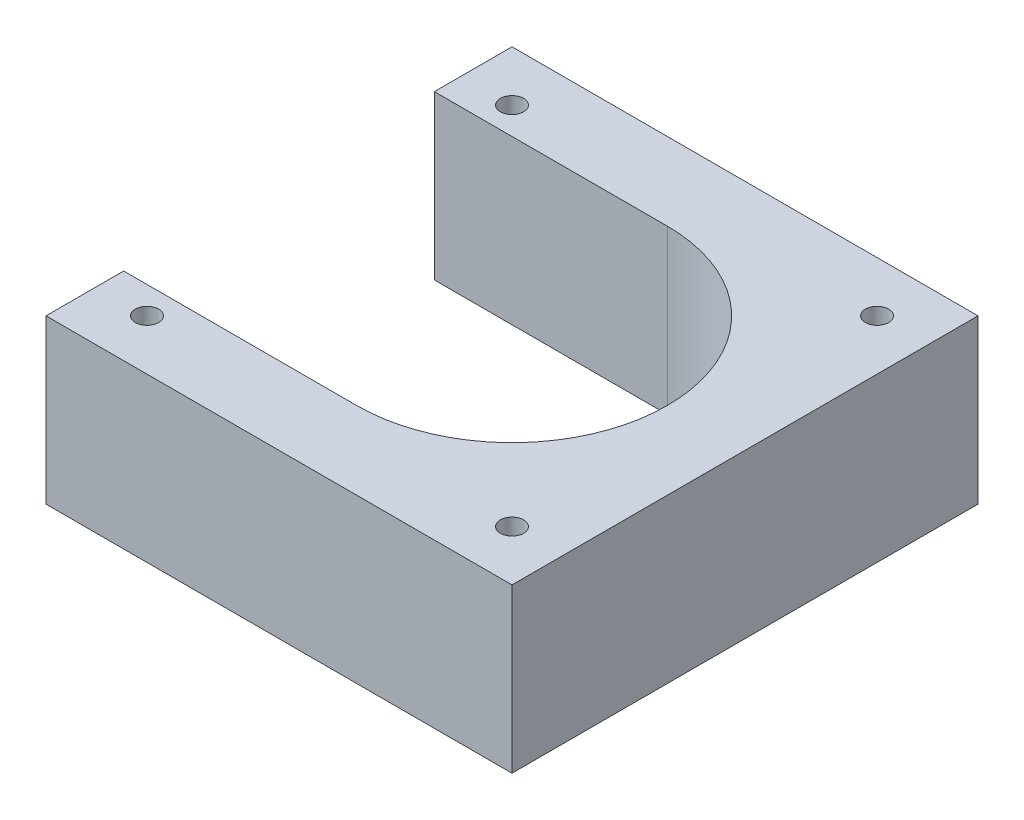
ISO-10303-21;
HEADER;
FILE_DESCRIPTION(('STEP AP214'),'2;1');
FILE_NAME('part.step','',(''),(''),'','','');
FILE_SCHEMA(('AUTOMOTIVE_DESIGN { 1 0 10303 214 1 1 1 1 }'));
ENDSEC;
DATA;
#1=APPLICATION_CONTEXT('core data for automotive mechanical design processes');
#2=APPLICATION_PROTOCOL_DEFINITION('international standard','automotive_design',2000,#1);
#3=PRODUCT_CONTEXT('',#1,'mechanical');
#4=PRODUCT('Part','Part','',(#3));
#5=PRODUCT_RELATED_PRODUCT_CATEGORY('part','',(#4));
#6=PRODUCT_DEFINITION_FORMATION('','',#4);
#7=PRODUCT_DEFINITION_CONTEXT('part definition',#1,'design');
#8=PRODUCT_DEFINITION('design','',#6,#7);
#9=PRODUCT_DEFINITION_SHAPE('','',#8);
#10=(LENGTH_UNIT() NAMED_UNIT(*) SI_UNIT(.MILLI.,.METRE.));
#11=(NAMED_UNIT(*) PLANE_ANGLE_UNIT() SI_UNIT($,.RADIAN.));
#12=(NAMED_UNIT(*) SI_UNIT($,.STERADIAN.) SOLID_ANGLE_UNIT());
#13=UNCERTAINTY_MEASURE_WITH_UNIT(LENGTH_MEASURE(1.E-05),#10,'distance_accuracy_value','');
#14=(GEOMETRIC_REPRESENTATION_CONTEXT(3) GLOBAL_UNCERTAINTY_ASSIGNED_CONTEXT((#13)) GLOBAL_UNIT_ASSIGNED_CONTEXT((#10,
#11,#12)) REPRESENTATION_CONTEXT('',''));
#15=CARTESIAN_POINT('',(0.,0.,0.));
#16=DIRECTION('',(0.,0.,1.));
#17=DIRECTION('',(1.,0.,0.));
#18=AXIS2_PLACEMENT_3D('',#15,#16,#17);
#19=CARTESIAN_POINT('',(0.,21.,0.));
#20=DIRECTION('',(0.,1.,0.));
#21=DIRECTION('',(0.,0.,1.));
#22=AXIS2_PLACEMENT_3D('',#19,#20,#21);
#23=PLANE('',#22);
#24=CARTESIAN_POINT('',(-23.5,21.,23.5));
#25=DIRECTION('',(0.,1.,0.));
#26=DIRECTION('',(0.,0.,1.));
#27=AXIS2_PLACEMENT_3D('',#24,#25,#26);
#28=CIRCLE('',#27,1.5);
#29=CARTESIAN_POINT('',(-23.5,21.,22.));
#30=VERTEX_POINT('',#29);
#31=EDGE_CURVE('E225',#30,#30,#28,.T.);
#32=ORIENTED_EDGE('',*,*,#31,.F.);
#33=EDGE_LOOP('',(#32));
#34=FACE_BOUND('',#33,.T.);
#35=CARTESIAN_POINT('',(-23.5,21.,-23.5));
#36=DIRECTION('',(0.,1.,0.));
#37=DIRECTION('',(0.,0.,1.));
#38=AXIS2_PLACEMENT_3D('',#35,#36,#37);
#39=CIRCLE('',#38,1.5);
#40=CARTESIAN_POINT('',(-23.5,21.,-25.));
#41=VERTEX_POINT('',#40);
#42=EDGE_CURVE('E150',#41,#41,#39,.T.);
#43=ORIENTED_EDGE('',*,*,#42,.F.);
#44=EDGE_LOOP('',(#43));
#45=FACE_BOUND('',#44,.T.);
#46=DIRECTION('',(0.,0.,-1.));
#47=VECTOR('',#46,1.);
#48=CARTESIAN_POINT('',(30.,21.,-30.));
#49=LINE('',#48,#47);
#50=CARTESIAN_POINT('',(30.,21.,30.));
#51=VERTEX_POINT('',#50);
#52=CARTESIAN_POINT('',(30.,21.,-30.));
#53=VERTEX_POINT('',#52);
#54=EDGE_CURVE('E168',#51,#53,#49,.T.);
#55=ORIENTED_EDGE('',*,*,#54,.T.);
#56=DIRECTION('',(-1.,0.,0.));
#57=VECTOR('',#56,1.);
#58=CARTESIAN_POINT('',(-30.,21.,-30.));
#59=LINE('',#58,#57);
#60=CARTESIAN_POINT('',(-30.,21.,-30.));
#61=VERTEX_POINT('',#60);
#62=EDGE_CURVE('E104',#53,#61,#59,.T.);
#63=ORIENTED_EDGE('',*,*,#62,.T.);
#64=DIRECTION('',(0.,0.,1.));
#65=VECTOR('',#64,1.);
#66=CARTESIAN_POINT('',(-30.,21.,-30.));
#67=LINE('',#66,#65);
#68=CARTESIAN_POINT('',(-30.,21.,-20.));
#69=VERTEX_POINT('',#68);
#70=EDGE_CURVE('E189',#61,#69,#67,.T.);
#71=ORIENTED_EDGE('',*,*,#70,.T.);
#72=DIRECTION('',(1.,0.,0.));
#73=VECTOR('',#72,1.);
#74=CARTESIAN_POINT('',(0.,21.,-20.));
#75=LINE('',#74,#73);
#76=CARTESIAN_POINT('',(0.,21.,-20.));
#77=VERTEX_POINT('',#76);
#78=EDGE_CURVE('E203',#69,#77,#75,.T.);
#79=ORIENTED_EDGE('',*,*,#78,.T.);
#80=CARTESIAN_POINT('',(0.,21.,0.));
#81=DIRECTION('',(0.,-1.,0.));
#82=DIRECTION('',(0.,0.,1.));
#83=AXIS2_PLACEMENT_3D('',#80,#81,#82);
#84=CIRCLE('',#83,20.);
#85=CARTESIAN_POINT('',(0.,21.,20.));
#86=VERTEX_POINT('',#85);
#87=EDGE_CURVE('E123',#77,#86,#84,.T.);
#88=ORIENTED_EDGE('',*,*,#87,.T.);
#89=DIRECTION('',(-1.,0.,0.));
#90=VECTOR('',#89,1.);
#91=CARTESIAN_POINT('',(0.,21.,20.));
#92=LINE('',#91,#90);
#93=CARTESIAN_POINT('',(-30.,21.,20.));
#94=VERTEX_POINT('',#93);
#95=EDGE_CURVE('E117',#86,#94,#92,.T.);
#96=ORIENTED_EDGE('',*,*,#95,.T.);
#97=DIRECTION('',(0.,0.,1.));
#98=VECTOR('',#97,1.);
#99=CARTESIAN_POINT('',(-30.,21.,20.));
#100=LINE('',#99,#98);
#101=CARTESIAN_POINT('',(-30.,21.,30.));
#102=VERTEX_POINT('',#101);
#103=EDGE_CURVE('E121',#94,#102,#100,.T.);
#104=ORIENTED_EDGE('',*,*,#103,.T.);
#105=DIRECTION('',(1.,0.,0.));
#106=VECTOR('',#105,1.);
#107=CARTESIAN_POINT('',(-30.,21.,30.));
#108=LINE('',#107,#106);
#109=EDGE_CURVE('E61',#102,#51,#108,.T.);
#110=ORIENTED_EDGE('',*,*,#109,.T.);
#111=EDGE_LOOP('',(#55,#63,#71,#79,#88,#96,#104,#110));
#112=FACE_BOUND('',#111,.T.);
#113=CARTESIAN_POINT('',(23.5,21.,-23.5));
#114=DIRECTION('',(0.,1.,0.));
#115=DIRECTION('',(0.,0.,1.));
#116=AXIS2_PLACEMENT_3D('',#113,#114,#115);
#117=CIRCLE('',#116,1.5);
#118=CARTESIAN_POINT('',(23.5,21.,-25.));
#119=VERTEX_POINT('',#118);
#120=EDGE_CURVE('E217',#119,#119,#117,.T.);
#121=ORIENTED_EDGE('',*,*,#120,.F.);
#122=EDGE_LOOP('',(#121));
#123=FACE_BOUND('',#122,.T.);
#124=CARTESIAN_POINT('',(23.5,21.,23.5));
#125=DIRECTION('',(0.,1.,0.));
#126=DIRECTION('',(0.,0.,1.));
#127=AXIS2_PLACEMENT_3D('',#124,#125,#126);
#128=CIRCLE('',#127,1.5);
#129=CARTESIAN_POINT('',(23.5,21.,22.));
#130=VERTEX_POINT('',#129);
#131=EDGE_CURVE('E233',#130,#130,#128,.T.);
#132=ORIENTED_EDGE('',*,*,#131,.F.);
#133=EDGE_LOOP('',(#132));
#134=FACE_BOUND('',#133,.T.);
#135=ADVANCED_FACE('F43',(#34,#45,#112,#123,#134),#23,.T.);
#136=CARTESIAN_POINT('',(0.,0.,0.));
#137=DIRECTION('',(0.,1.,0.));
#138=DIRECTION('',(0.,0.,1.));
#139=AXIS2_PLACEMENT_3D('',#136,#137,#138);
#140=PLANE('',#139);
#141=DIRECTION('',(0.,0.,-1.));
#142=VECTOR('',#141,1.);
#143=CARTESIAN_POINT('',(30.,0.,-30.));
#144=LINE('',#143,#142);
#145=CARTESIAN_POINT('',(30.,0.,30.));
#146=VERTEX_POINT('',#145);
#147=CARTESIAN_POINT('',(30.,0.,-30.));
#148=VERTEX_POINT('',#147);
#149=EDGE_CURVE('E145',#146,#148,#144,.T.);
#150=ORIENTED_EDGE('',*,*,#149,.F.);
#151=DIRECTION('',(1.,0.,0.));
#152=VECTOR('',#151,1.);
#153=CARTESIAN_POINT('',(-30.,0.,30.));
#154=LINE('',#153,#152);
#155=CARTESIAN_POINT('',(-30.,0.,30.));
#156=VERTEX_POINT('',#155);
#157=EDGE_CURVE('E96',#156,#146,#154,.T.);
#158=ORIENTED_EDGE('',*,*,#157,.F.);
#159=DIRECTION('',(0.,0.,1.));
#160=VECTOR('',#159,1.);
#161=CARTESIAN_POINT('',(-30.,0.,20.));
#162=LINE('',#161,#160);
#163=CARTESIAN_POINT('',(-30.,0.,20.));
#164=VERTEX_POINT('',#163);
#165=EDGE_CURVE('E90',#164,#156,#162,.T.);
#166=ORIENTED_EDGE('',*,*,#165,.F.);
#167=DIRECTION('',(-1.,0.,0.));
#168=VECTOR('',#167,1.);
#169=CARTESIAN_POINT('',(0.,0.,20.));
#170=LINE('',#169,#168);
#171=CARTESIAN_POINT('',(0.,0.,20.));
#172=VERTEX_POINT('',#171);
#173=EDGE_CURVE('E132',#172,#164,#170,.T.);
#174=ORIENTED_EDGE('',*,*,#173,.F.);
#175=CARTESIAN_POINT('',(0.,0.,0.));
#176=DIRECTION('',(0.,-1.,0.));
#177=DIRECTION('',(0.,0.,1.));
#178=AXIS2_PLACEMENT_3D('',#175,#176,#177);
#179=CIRCLE('',#178,20.);
#180=CARTESIAN_POINT('',(0.,0.,-20.));
#181=VERTEX_POINT('',#180);
#182=EDGE_CURVE('E159',#181,#172,#179,.T.);
#183=ORIENTED_EDGE('',*,*,#182,.F.);
#184=DIRECTION('',(1.,0.,0.));
#185=VECTOR('',#184,1.);
#186=CARTESIAN_POINT('',(0.,0.,-20.));
#187=LINE('',#186,#185);
#188=CARTESIAN_POINT('',(-30.,0.,-20.));
#189=VERTEX_POINT('',#188);
#190=EDGE_CURVE('E156',#189,#181,#187,.T.);
#191=ORIENTED_EDGE('',*,*,#190,.F.);
#192=DIRECTION('',(0.,0.,1.));
#193=VECTOR('',#192,1.);
#194=CARTESIAN_POINT('',(-30.,0.,-30.));
#195=LINE('',#194,#193);
#196=CARTESIAN_POINT('',(-30.,0.,-30.));
#197=VERTEX_POINT('',#196);
#198=EDGE_CURVE('E153',#197,#189,#195,.T.);
#199=ORIENTED_EDGE('',*,*,#198,.F.);
#200=DIRECTION('',(-1.,0.,0.));
#201=VECTOR('',#200,1.);
#202=CARTESIAN_POINT('',(-30.,0.,-30.));
#203=LINE('',#202,#201);
#204=EDGE_CURVE('E149',#148,#197,#203,.T.);
#205=ORIENTED_EDGE('',*,*,#204,.F.);
#206=EDGE_LOOP('',(#150,#158,#166,#174,#183,#191,#199,#205));
#207=FACE_BOUND('',#206,.T.);
#208=CARTESIAN_POINT('',(-23.5,0.,-23.5));
#209=DIRECTION('',(0.,1.,0.));
#210=DIRECTION('',(0.,0.,1.));
#211=AXIS2_PLACEMENT_3D('',#208,#209,#210);
#212=CIRCLE('',#211,1.5);
#213=CARTESIAN_POINT('',(-23.5,0.,-25.));
#214=VERTEX_POINT('',#213);
#215=EDGE_CURVE('E213',#214,#214,#212,.T.);
#216=ORIENTED_EDGE('',*,*,#215,.T.);
#217=EDGE_LOOP('',(#216));
#218=FACE_BOUND('',#217,.T.);
#219=CARTESIAN_POINT('',(23.5,0.,-23.5));
#220=DIRECTION('',(0.,1.,0.));
#221=DIRECTION('',(0.,0.,1.));
#222=AXIS2_PLACEMENT_3D('',#219,#220,#221);
#223=CIRCLE('',#222,1.5);
#224=CARTESIAN_POINT('',(23.5,0.,-25.));
#225=VERTEX_POINT('',#224);
#226=EDGE_CURVE('E221',#225,#225,#223,.T.);
#227=ORIENTED_EDGE('',*,*,#226,.T.);
#228=EDGE_LOOP('',(#227));
#229=FACE_BOUND('',#228,.T.);
#230=CARTESIAN_POINT('',(-23.5,0.,23.5));
#231=DIRECTION('',(0.,1.,0.));
#232=DIRECTION('',(0.,0.,1.));
#233=AXIS2_PLACEMENT_3D('',#230,#231,#232);
#234=CIRCLE('',#233,1.5);
#235=CARTESIAN_POINT('',(-23.5,0.,22.));
#236=VERTEX_POINT('',#235);
#237=EDGE_CURVE('E229',#236,#236,#234,.T.);
#238=ORIENTED_EDGE('',*,*,#237,.T.);
#239=EDGE_LOOP('',(#238));
#240=FACE_BOUND('',#239,.T.);
#241=CARTESIAN_POINT('',(23.5,0.,23.5));
#242=DIRECTION('',(0.,1.,0.));
#243=DIRECTION('',(0.,0.,1.));
#244=AXIS2_PLACEMENT_3D('',#241,#242,#243);
#245=CIRCLE('',#244,1.5);
#246=CARTESIAN_POINT('',(23.5,0.,22.));
#247=VERTEX_POINT('',#246);
#248=EDGE_CURVE('E237',#247,#247,#245,.T.);
#249=ORIENTED_EDGE('',*,*,#248,.T.);
#250=EDGE_LOOP('',(#249));
#251=FACE_BOUND('',#250,.T.);
#252=ADVANCED_FACE('F193',(#207,#218,#229,#240,#251),#140,.F.);
#253=CARTESIAN_POINT('',(30.,21.,-30.));
#254=DIRECTION('',(-1.,0.,0.));
#255=DIRECTION('',(0.,0.,1.));
#256=AXIS2_PLACEMENT_3D('',#253,#254,#255);
#257=PLANE('',#256);
#258=ORIENTED_EDGE('',*,*,#149,.T.);
#259=DIRECTION('',(0.,-1.,0.));
#260=VECTOR('',#259,1.);
#261=CARTESIAN_POINT('',(30.,21.,-30.));
#262=LINE('',#261,#260);
#263=EDGE_CURVE('E11',#53,#148,#262,.T.);
#264=ORIENTED_EDGE('',*,*,#263,.F.);
#265=ORIENTED_EDGE('',*,*,#54,.F.);
#266=DIRECTION('',(0.,-1.,0.));
#267=VECTOR('',#266,1.);
#268=CARTESIAN_POINT('',(30.,21.,30.));
#269=LINE('',#268,#267);
#270=EDGE_CURVE('E141',#51,#146,#269,.T.);
#271=ORIENTED_EDGE('',*,*,#270,.T.);
#272=EDGE_LOOP('',(#258,#264,#265,#271));
#273=FACE_BOUND('',#272,.T.);
#274=ADVANCED_FACE('F45',(#273),#257,.F.);
#275=CARTESIAN_POINT('',(-30.,21.,-30.));
#276=DIRECTION('',(0.,0.,1.));
#277=DIRECTION('',(1.,0.,0.));
#278=AXIS2_PLACEMENT_3D('',#275,#276,#277);
#279=PLANE('',#278);
#280=ORIENTED_EDGE('',*,*,#204,.T.);
#281=DIRECTION('',(0.,-1.,0.));
#282=VECTOR('',#281,1.);
#283=CARTESIAN_POINT('',(-30.,21.,-30.));
#284=LINE('',#283,#282);
#285=EDGE_CURVE('E53',#61,#197,#284,.T.);
#286=ORIENTED_EDGE('',*,*,#285,.F.);
#287=ORIENTED_EDGE('',*,*,#62,.F.);
#288=ORIENTED_EDGE('',*,*,#263,.T.);
#289=EDGE_LOOP('',(#280,#286,#287,#288));
#290=FACE_BOUND('',#289,.T.);
#291=ADVANCED_FACE('F273',(#290),#279,.F.);
#292=CARTESIAN_POINT('',(-30.,21.,-30.));
#293=DIRECTION('',(1.,0.,0.));
#294=DIRECTION('',(0.,0.,-1.));
#295=AXIS2_PLACEMENT_3D('',#292,#293,#294);
#296=PLANE('',#295);
#297=ORIENTED_EDGE('',*,*,#198,.T.);
#298=DIRECTION('',(0.,-1.,0.));
#299=VECTOR('',#298,1.);
#300=CARTESIAN_POINT('',(-30.,21.,-20.));
#301=LINE('',#300,#299);
#302=EDGE_CURVE('E179',#69,#189,#301,.T.);
#303=ORIENTED_EDGE('',*,*,#302,.F.);
#304=ORIENTED_EDGE('',*,*,#70,.F.);
#305=ORIENTED_EDGE('',*,*,#285,.T.);
#306=EDGE_LOOP('',(#297,#303,#304,#305));
#307=FACE_BOUND('',#306,.T.);
#308=ADVANCED_FACE('F187',(#307),#296,.F.);
#309=CARTESIAN_POINT('',(0.,21.,-20.));
#310=DIRECTION('',(0.,0.,-1.));
#311=DIRECTION('',(-1.,0.,0.));
#312=AXIS2_PLACEMENT_3D('',#309,#310,#311);
#313=PLANE('',#312);
#314=ORIENTED_EDGE('',*,*,#190,.T.);
#315=DIRECTION('',(0.,-1.,0.));
#316=VECTOR('',#315,1.);
#317=CARTESIAN_POINT('',(0.,21.,-20.));
#318=LINE('',#317,#316);
#319=EDGE_CURVE('E175',#77,#181,#318,.T.);
#320=ORIENTED_EDGE('',*,*,#319,.F.);
#321=ORIENTED_EDGE('',*,*,#78,.F.);
#322=ORIENTED_EDGE('',*,*,#302,.T.);
#323=EDGE_LOOP('',(#314,#320,#321,#322));
#324=FACE_BOUND('',#323,.T.);
#325=ADVANCED_FACE('F198',(#324),#313,.F.);
#326=CARTESIAN_POINT('',(0.,21.,0.));
#327=DIRECTION('',(0.,-1.,0.));
#328=DIRECTION('',(0.,0.,-1.));
#329=AXIS2_PLACEMENT_3D('',#326,#327,#328);
#330=CYLINDRICAL_SURFACE('',#329,20.);
#331=ORIENTED_EDGE('',*,*,#182,.T.);
#332=DIRECTION('',(0.,-1.,0.));
#333=VECTOR('',#332,1.);
#334=CARTESIAN_POINT('',(0.,21.,20.));
#335=LINE('',#334,#333);
#336=EDGE_CURVE('E134',#86,#172,#335,.T.);
#337=ORIENTED_EDGE('',*,*,#336,.F.);
#338=ORIENTED_EDGE('',*,*,#87,.F.);
#339=ORIENTED_EDGE('',*,*,#319,.T.);
#340=EDGE_LOOP('',(#331,#337,#338,#339));
#341=FACE_BOUND('',#340,.T.);
#342=ADVANCED_FACE('F201',(#341),#330,.F.);
#343=CARTESIAN_POINT('',(0.,21.,20.));
#344=DIRECTION('',(0.,0.,1.));
#345=DIRECTION('',(1.,0.,0.));
#346=AXIS2_PLACEMENT_3D('',#343,#344,#345);
#347=PLANE('',#346);
#348=ORIENTED_EDGE('',*,*,#173,.T.);
#349=DIRECTION('',(0.,-1.,0.));
#350=VECTOR('',#349,1.);
#351=CARTESIAN_POINT('',(-30.,21.,20.));
#352=LINE('',#351,#350);
#353=EDGE_CURVE('E129',#94,#164,#352,.T.);
#354=ORIENTED_EDGE('',*,*,#353,.F.);
#355=ORIENTED_EDGE('',*,*,#95,.F.);
#356=ORIENTED_EDGE('',*,*,#336,.T.);
#357=EDGE_LOOP('',(#348,#354,#355,#356));
#358=FACE_BOUND('',#357,.T.);
#359=ADVANCED_FACE('F130',(#358),#347,.F.);
#360=CARTESIAN_POINT('',(-30.,21.,20.));
#361=DIRECTION('',(1.,0.,0.));
#362=DIRECTION('',(0.,0.,-1.));
#363=AXIS2_PLACEMENT_3D('',#360,#361,#362);
#364=PLANE('',#363);
#365=ORIENTED_EDGE('',*,*,#165,.T.);
#366=DIRECTION('',(0.,-1.,0.));
#367=VECTOR('',#366,1.);
#368=CARTESIAN_POINT('',(-30.,21.,30.));
#369=LINE('',#368,#367);
#370=EDGE_CURVE('E135',#102,#156,#369,.T.);
#371=ORIENTED_EDGE('',*,*,#370,.F.);
#372=ORIENTED_EDGE('',*,*,#103,.F.);
#373=ORIENTED_EDGE('',*,*,#353,.T.);
#374=EDGE_LOOP('',(#365,#371,#372,#373));
#375=FACE_BOUND('',#374,.T.);
#376=ADVANCED_FACE('F137',(#375),#364,.F.);
#377=CARTESIAN_POINT('',(-30.,21.,30.));
#378=DIRECTION('',(0.,0.,-1.));
#379=DIRECTION('',(-1.,0.,0.));
#380=AXIS2_PLACEMENT_3D('',#377,#378,#379);
#381=PLANE('',#380);
#382=ORIENTED_EDGE('',*,*,#157,.T.);
#383=ORIENTED_EDGE('',*,*,#270,.F.);
#384=ORIENTED_EDGE('',*,*,#109,.F.);
#385=ORIENTED_EDGE('',*,*,#370,.T.);
#386=EDGE_LOOP('',(#382,#383,#384,#385));
#387=FACE_BOUND('',#386,.T.);
#388=ADVANCED_FACE('F261',(#387),#381,.F.);
#389=CARTESIAN_POINT('',(-23.5,21.,-23.5));
#390=DIRECTION('',(0.,-1.,0.));
#391=DIRECTION('',(0.,0.,-1.));
#392=AXIS2_PLACEMENT_3D('',#389,#390,#391);
#393=CYLINDRICAL_SURFACE('',#392,1.5);
#394=CARTESIAN_POINT('',(-23.5,21.,-25.));
#395=CARTESIAN_POINT('',(-23.5,20.78125,-25.));
#396=CARTESIAN_POINT('',(-23.5,20.5625,-25.));
#397=CARTESIAN_POINT('',(-23.5,20.125,-25.));
#398=CARTESIAN_POINT('',(-23.5,19.90625,-25.));
#399=CARTESIAN_POINT('',(-23.5,19.46875,-25.));
#400=CARTESIAN_POINT('',(-23.5,19.25,-25.));
#401=CARTESIAN_POINT('',(-23.5,18.8125,-25.));
#402=CARTESIAN_POINT('',(-23.5,18.59375,-25.));
#403=CARTESIAN_POINT('',(-23.5,18.15625,-25.));
#404=CARTESIAN_POINT('',(-23.5,17.9375,-25.));
#405=CARTESIAN_POINT('',(-23.5,17.5,-25.));
#406=CARTESIAN_POINT('',(-23.5,17.28125,-25.));
#407=CARTESIAN_POINT('',(-23.5,16.84375,-25.));
#408=CARTESIAN_POINT('',(-23.5,16.625,-25.));
#409=CARTESIAN_POINT('',(-23.5,16.1875,-25.));
#410=CARTESIAN_POINT('',(-23.5,15.96875,-25.));
#411=CARTESIAN_POINT('',(-23.5,15.53125,-25.));
#412=CARTESIAN_POINT('',(-23.5,15.3125,-25.));
#413=CARTESIAN_POINT('',(-23.5,14.875,-25.));
#414=CARTESIAN_POINT('',(-23.5,14.65625,-25.));
#415=CARTESIAN_POINT('',(-23.5,14.21875,-25.));
#416=CARTESIAN_POINT('',(-23.5,14.,-25.));
#417=CARTESIAN_POINT('',(-23.5,13.5625,-25.));
#418=CARTESIAN_POINT('',(-23.5,13.34375,-25.));
#419=CARTESIAN_POINT('',(-23.5,12.90625,-25.));
#420=CARTESIAN_POINT('',(-23.5,12.6875,-25.));
#421=CARTESIAN_POINT('',(-23.5,12.25,-25.));
#422=CARTESIAN_POINT('',(-23.5,12.03125,-25.));
#423=CARTESIAN_POINT('',(-23.5,11.59375,-25.));
#424=CARTESIAN_POINT('',(-23.5,11.375,-25.));
#425=CARTESIAN_POINT('',(-23.5,10.9375,-25.));
#426=CARTESIAN_POINT('',(-23.5,10.71875,-25.));
#427=CARTESIAN_POINT('',(-23.5,10.28125,-25.));
#428=CARTESIAN_POINT('',(-23.5,10.0625,-25.));
#429=CARTESIAN_POINT('',(-23.5,9.625,-25.));
#430=CARTESIAN_POINT('',(-23.5,9.40625,-25.));
#431=CARTESIAN_POINT('',(-23.5,8.96875,-25.));
#432=CARTESIAN_POINT('',(-23.5,8.75,-25.));
#433=CARTESIAN_POINT('',(-23.5,8.3125,-25.));
#434=CARTESIAN_POINT('',(-23.5,8.09375,-25.));
#435=CARTESIAN_POINT('',(-23.5,7.65625,-25.));
#436=CARTESIAN_POINT('',(-23.5,7.4375,-25.));
#437=CARTESIAN_POINT('',(-23.5,7.,-25.));
#438=CARTESIAN_POINT('',(-23.5,6.78125,-25.));
#439=CARTESIAN_POINT('',(-23.5,6.34375,-25.));
#440=CARTESIAN_POINT('',(-23.5,6.125,-25.));
#441=CARTESIAN_POINT('',(-23.5,5.6875,-25.));
#442=CARTESIAN_POINT('',(-23.5,5.46875,-25.));
#443=CARTESIAN_POINT('',(-23.5,5.03125,-25.));
#444=CARTESIAN_POINT('',(-23.5,4.8125,-25.));
#445=CARTESIAN_POINT('',(-23.5,4.375,-25.));
#446=CARTESIAN_POINT('',(-23.5,4.15625,-25.));
#447=CARTESIAN_POINT('',(-23.5,3.71875,-25.));
#448=CARTESIAN_POINT('',(-23.5,3.5,-25.));
#449=CARTESIAN_POINT('',(-23.5,3.0625,-25.));
#450=CARTESIAN_POINT('',(-23.5,2.84375,-25.));
#451=CARTESIAN_POINT('',(-23.5,2.40625,-25.));
#452=CARTESIAN_POINT('',(-23.5,2.1875,-25.));
#453=CARTESIAN_POINT('',(-23.5,1.75,-25.));
#454=CARTESIAN_POINT('',(-23.5,1.53125,-25.));
#455=CARTESIAN_POINT('',(-23.5,1.09375,-25.));
#456=CARTESIAN_POINT('',(-23.5,0.875000000000001,-25.));
#457=CARTESIAN_POINT('',(-23.5,0.4375,-25.));
#458=CARTESIAN_POINT('',(-23.5,0.21875,-25.));
#459=CARTESIAN_POINT('',(-23.5,0.,-25.));
#460=B_SPLINE_CURVE_WITH_KNOTS('',3,(#394,#395,#396,#397,#398,#399,#400,#401,#402,#403,#404,
#405,#406,#407,#408,#409,#410,#411,#412,#413,#414,#415,#416,#417,#418,#419,#420,#421,#422,#423,
#424,#425,#426,#427,#428,#429,#430,#431,#432,#433,#434,#435,#436,#437,#438,#439,#440,#441,#442,
#443,#444,#445,#446,#447,#448,#449,#450,#451,#452,#453,#454,#455,#456,#457,#458,#459),
.UNSPECIFIED.,.F.,.F.,(4,2,2,2,2,2,2,2,2,2,2,2,2,2,2,2,2,2,2,2,2,2,2,2,2,2,2,2,2,2,2,2,4),(0.,
0.656249999999997,1.3125,1.96875,2.625,3.28125,3.9375,4.59375,5.25,5.90625,6.5625,7.21875,7.875,
8.53125,9.1875,9.84375,10.5,11.15625,11.8125,12.46875,13.125,13.78125,14.4375,15.09375,15.75,
16.40625,17.0625,17.71875,18.375,19.03125,19.6875,20.34375,21.),.UNSPECIFIED.);
#461=EDGE_CURVE('BSEAM258',#41,#214,#460,.T.);
#462=ORIENTED_EDGE('',*,*,#42,.T.);
#463=ORIENTED_EDGE('',*,*,#215,.F.);
#464=ORIENTED_EDGE('',*,*,#461,.T.);
#465=ORIENTED_EDGE('',*,*,#461,.F.);
#466=EDGE_LOOP('',(#462,#464,#463,#465));
#467=FACE_BOUND('',#466,.T.);
#468=ADVANCED_FACE('F258',(#467),#393,.F.);
#469=CARTESIAN_POINT('',(23.5,21.,-23.5));
#470=DIRECTION('',(0.,-1.,0.));
#471=DIRECTION('',(0.,0.,-1.));
#472=AXIS2_PLACEMENT_3D('',#469,#470,#471);
#473=CYLINDRICAL_SURFACE('',#472,1.5);
#474=CARTESIAN_POINT('',(23.5,21.,-25.));
#475=CARTESIAN_POINT('',(23.5,20.78125,-25.));
#476=CARTESIAN_POINT('',(23.5,20.5625,-25.));
#477=CARTESIAN_POINT('',(23.5,20.125,-25.));
#478=CARTESIAN_POINT('',(23.5,19.90625,-25.));
#479=CARTESIAN_POINT('',(23.5,19.46875,-25.));
#480=CARTESIAN_POINT('',(23.5,19.25,-25.));
#481=CARTESIAN_POINT('',(23.5,18.8125,-25.));
#482=CARTESIAN_POINT('',(23.5,18.59375,-25.));
#483=CARTESIAN_POINT('',(23.5,18.15625,-25.));
#484=CARTESIAN_POINT('',(23.5,17.9375,-25.));
#485=CARTESIAN_POINT('',(23.5,17.5,-25.));
#486=CARTESIAN_POINT('',(23.5,17.28125,-25.));
#487=CARTESIAN_POINT('',(23.5,16.84375,-25.));
#488=CARTESIAN_POINT('',(23.5,16.625,-25.));
#489=CARTESIAN_POINT('',(23.5,16.1875,-25.));
#490=CARTESIAN_POINT('',(23.5,15.96875,-25.));
#491=CARTESIAN_POINT('',(23.5,15.53125,-25.));
#492=CARTESIAN_POINT('',(23.5,15.3125,-25.));
#493=CARTESIAN_POINT('',(23.5,14.875,-25.));
#494=CARTESIAN_POINT('',(23.5,14.65625,-25.));
#495=CARTESIAN_POINT('',(23.5,14.21875,-25.));
#496=CARTESIAN_POINT('',(23.5,14.,-25.));
#497=CARTESIAN_POINT('',(23.5,13.5625,-25.));
#498=CARTESIAN_POINT('',(23.5,13.34375,-25.));
#499=CARTESIAN_POINT('',(23.5,12.90625,-25.));
#500=CARTESIAN_POINT('',(23.5,12.6875,-25.));
#501=CARTESIAN_POINT('',(23.5,12.25,-25.));
#502=CARTESIAN_POINT('',(23.5,12.03125,-25.));
#503=CARTESIAN_POINT('',(23.5,11.59375,-25.));
#504=CARTESIAN_POINT('',(23.5,11.375,-25.));
#505=CARTESIAN_POINT('',(23.5,10.9375,-25.));
#506=CARTESIAN_POINT('',(23.5,10.71875,-25.));
#507=CARTESIAN_POINT('',(23.5,10.28125,-25.));
#508=CARTESIAN_POINT('',(23.5,10.0625,-25.));
#509=CARTESIAN_POINT('',(23.5,9.625,-25.));
#510=CARTESIAN_POINT('',(23.5,9.40625,-25.));
#511=CARTESIAN_POINT('',(23.5,8.96875,-25.));
#512=CARTESIAN_POINT('',(23.5,8.75,-25.));
#513=CARTESIAN_POINT('',(23.5,8.3125,-25.));
#514=CARTESIAN_POINT('',(23.5,8.09375,-25.));
#515=CARTESIAN_POINT('',(23.5,7.65625,-25.));
#516=CARTESIAN_POINT('',(23.5,7.4375,-25.));
#517=CARTESIAN_POINT('',(23.5,7.,-25.));
#518=CARTESIAN_POINT('',(23.5,6.78125,-25.));
#519=CARTESIAN_POINT('',(23.5,6.34375,-25.));
#520=CARTESIAN_POINT('',(23.5,6.125,-25.));
#521=CARTESIAN_POINT('',(23.5,5.6875,-25.));
#522=CARTESIAN_POINT('',(23.5,5.46875,-25.));
#523=CARTESIAN_POINT('',(23.5,5.03125,-25.));
#524=CARTESIAN_POINT('',(23.5,4.8125,-25.));
#525=CARTESIAN_POINT('',(23.5,4.375,-25.));
#526=CARTESIAN_POINT('',(23.5,4.15625,-25.));
#527=CARTESIAN_POINT('',(23.5,3.71875,-25.));
#528=CARTESIAN_POINT('',(23.5,3.5,-25.));
#529=CARTESIAN_POINT('',(23.5,3.0625,-25.));
#530=CARTESIAN_POINT('',(23.5,2.84375,-25.));
#531=CARTESIAN_POINT('',(23.5,2.40625,-25.));
#532=CARTESIAN_POINT('',(23.5,2.1875,-25.));
#533=CARTESIAN_POINT('',(23.5,1.75,-25.));
#534=CARTESIAN_POINT('',(23.5,1.53125,-25.));
#535=CARTESIAN_POINT('',(23.5,1.09375,-25.));
#536=CARTESIAN_POINT('',(23.5,0.875000000000001,-25.));
#537=CARTESIAN_POINT('',(23.5,0.4375,-25.));
#538=CARTESIAN_POINT('',(23.5,0.21875,-25.));
#539=CARTESIAN_POINT('',(23.5,0.,-25.));
#540=B_SPLINE_CURVE_WITH_KNOTS('',3,(#474,#475,#476,#477,#478,#479,#480,#481,#482,#483,#484,
#485,#486,#487,#488,#489,#490,#491,#492,#493,#494,#495,#496,#497,#498,#499,#500,#501,#502,#503,
#504,#505,#506,#507,#508,#509,#510,#511,#512,#513,#514,#515,#516,#517,#518,#519,#520,#521,#522,
#523,#524,#525,#526,#527,#528,#529,#530,#531,#532,#533,#534,#535,#536,#537,#538,#539),
.UNSPECIFIED.,.F.,.F.,(4,2,2,2,2,2,2,2,2,2,2,2,2,2,2,2,2,2,2,2,2,2,2,2,2,2,2,2,2,2,2,2,4),(0.,
0.656249999999997,1.3125,1.96875,2.625,3.28125,3.9375,4.59375,5.25,5.90625,6.5625,7.21875,7.875,
8.53125,9.1875,9.84375,10.5,11.15625,11.8125,12.46875,13.125,13.78125,14.4375,15.09375,15.75,
16.40625,17.0625,17.71875,18.375,19.03125,19.6875,20.34375,21.),.UNSPECIFIED.);
#541=EDGE_CURVE('BSEAM349',#119,#225,#540,.T.);
#542=ORIENTED_EDGE('',*,*,#120,.T.);
#543=ORIENTED_EDGE('',*,*,#226,.F.);
#544=ORIENTED_EDGE('',*,*,#541,.T.);
#545=ORIENTED_EDGE('',*,*,#541,.F.);
#546=EDGE_LOOP('',(#542,#544,#543,#545));
#547=FACE_BOUND('',#546,.T.);
#548=ADVANCED_FACE('F349',(#547),#473,.F.);
#549=CARTESIAN_POINT('',(-23.5,21.,23.5));
#550=DIRECTION('',(0.,-1.,0.));
#551=DIRECTION('',(0.,0.,-1.));
#552=AXIS2_PLACEMENT_3D('',#549,#550,#551);
#553=CYLINDRICAL_SURFACE('',#552,1.5);
#554=CARTESIAN_POINT('',(-23.5,21.,22.));
#555=CARTESIAN_POINT('',(-23.5,20.78125,22.));
#556=CARTESIAN_POINT('',(-23.5,20.5625,22.));
#557=CARTESIAN_POINT('',(-23.5,20.125,22.));
#558=CARTESIAN_POINT('',(-23.5,19.90625,22.));
#559=CARTESIAN_POINT('',(-23.5,19.46875,22.));
#560=CARTESIAN_POINT('',(-23.5,19.25,22.));
#561=CARTESIAN_POINT('',(-23.5,18.8125,22.));
#562=CARTESIAN_POINT('',(-23.5,18.59375,22.));
#563=CARTESIAN_POINT('',(-23.5,18.15625,22.));
#564=CARTESIAN_POINT('',(-23.5,17.9375,22.));
#565=CARTESIAN_POINT('',(-23.5,17.5,22.));
#566=CARTESIAN_POINT('',(-23.5,17.28125,22.));
#567=CARTESIAN_POINT('',(-23.5,16.84375,22.));
#568=CARTESIAN_POINT('',(-23.5,16.625,22.));
#569=CARTESIAN_POINT('',(-23.5,16.1875,22.));
#570=CARTESIAN_POINT('',(-23.5,15.96875,22.));
#571=CARTESIAN_POINT('',(-23.5,15.53125,22.));
#572=CARTESIAN_POINT('',(-23.5,15.3125,22.));
#573=CARTESIAN_POINT('',(-23.5,14.875,22.));
#574=CARTESIAN_POINT('',(-23.5,14.65625,22.));
#575=CARTESIAN_POINT('',(-23.5,14.21875,22.));
#576=CARTESIAN_POINT('',(-23.5,14.,22.));
#577=CARTESIAN_POINT('',(-23.5,13.5625,22.));
#578=CARTESIAN_POINT('',(-23.5,13.34375,22.));
#579=CARTESIAN_POINT('',(-23.5,12.90625,22.));
#580=CARTESIAN_POINT('',(-23.5,12.6875,22.));
#581=CARTESIAN_POINT('',(-23.5,12.25,22.));
#582=CARTESIAN_POINT('',(-23.5,12.03125,22.));
#583=CARTESIAN_POINT('',(-23.5,11.59375,22.));
#584=CARTESIAN_POINT('',(-23.5,11.375,22.));
#585=CARTESIAN_POINT('',(-23.5,10.9375,22.));
#586=CARTESIAN_POINT('',(-23.5,10.71875,22.));
#587=CARTESIAN_POINT('',(-23.5,10.28125,22.));
#588=CARTESIAN_POINT('',(-23.5,10.0625,22.));
#589=CARTESIAN_POINT('',(-23.5,9.625,22.));
#590=CARTESIAN_POINT('',(-23.5,9.40625,22.));
#591=CARTESIAN_POINT('',(-23.5,8.96875,22.));
#592=CARTESIAN_POINT('',(-23.5,8.75,22.));
#593=CARTESIAN_POINT('',(-23.5,8.3125,22.));
#594=CARTESIAN_POINT('',(-23.5,8.09375,22.));
#595=CARTESIAN_POINT('',(-23.5,7.65625,22.));
#596=CARTESIAN_POINT('',(-23.5,7.4375,22.));
#597=CARTESIAN_POINT('',(-23.5,7.,22.));
#598=CARTESIAN_POINT('',(-23.5,6.78125,22.));
#599=CARTESIAN_POINT('',(-23.5,6.34375,22.));
#600=CARTESIAN_POINT('',(-23.5,6.125,22.));
#601=CARTESIAN_POINT('',(-23.5,5.6875,22.));
#602=CARTESIAN_POINT('',(-23.5,5.46875,22.));
#603=CARTESIAN_POINT('',(-23.5,5.03125,22.));
#604=CARTESIAN_POINT('',(-23.5,4.8125,22.));
#605=CARTESIAN_POINT('',(-23.5,4.375,22.));
#606=CARTESIAN_POINT('',(-23.5,4.15625,22.));
#607=CARTESIAN_POINT('',(-23.5,3.71875,22.));
#608=CARTESIAN_POINT('',(-23.5,3.5,22.));
#609=CARTESIAN_POINT('',(-23.5,3.0625,22.));
#610=CARTESIAN_POINT('',(-23.5,2.84375,22.));
#611=CARTESIAN_POINT('',(-23.5,2.40625,22.));
#612=CARTESIAN_POINT('',(-23.5,2.1875,22.));
#613=CARTESIAN_POINT('',(-23.5,1.75,22.));
#614=CARTESIAN_POINT('',(-23.5,1.53125,22.));
#615=CARTESIAN_POINT('',(-23.5,1.09375,22.));
#616=CARTESIAN_POINT('',(-23.5,0.875000000000001,22.));
#617=CARTESIAN_POINT('',(-23.5,0.4375,22.));
#618=CARTESIAN_POINT('',(-23.5,0.21875,22.));
#619=CARTESIAN_POINT('',(-23.5,0.,22.));
#620=B_SPLINE_CURVE_WITH_KNOTS('',3,(#554,#555,#556,#557,#558,#559,#560,#561,#562,#563,#564,
#565,#566,#567,#568,#569,#570,#571,#572,#573,#574,#575,#576,#577,#578,#579,#580,#581,#582,#583,
#584,#585,#586,#587,#588,#589,#590,#591,#592,#593,#594,#595,#596,#597,#598,#599,#600,#601,#602,
#603,#604,#605,#606,#607,#608,#609,#610,#611,#612,#613,#614,#615,#616,#617,#618,#619),
.UNSPECIFIED.,.F.,.F.,(4,2,2,2,2,2,2,2,2,2,2,2,2,2,2,2,2,2,2,2,2,2,2,2,2,2,2,2,2,2,2,2,4),(0.,
0.656249999999997,1.3125,1.96875,2.625,3.28125,3.9375,4.59375,5.25,5.90625,6.5625,7.21875,7.875,
8.53125,9.1875,9.84375,10.5,11.15625,11.8125,12.46875,13.125,13.78125,14.4375,15.09375,15.75,
16.40625,17.0625,17.71875,18.375,19.03125,19.6875,20.34375,21.),.UNSPECIFIED.);
#621=EDGE_CURVE('BSEAM358',#30,#236,#620,.T.);
#622=ORIENTED_EDGE('',*,*,#31,.T.);
#623=ORIENTED_EDGE('',*,*,#237,.F.);
#624=ORIENTED_EDGE('',*,*,#621,.T.);
#625=ORIENTED_EDGE('',*,*,#621,.F.);
#626=EDGE_LOOP('',(#622,#624,#623,#625));
#627=FACE_BOUND('',#626,.T.);
#628=ADVANCED_FACE('F358',(#627),#553,.F.);
#629=CARTESIAN_POINT('',(23.5,21.,23.5));
#630=DIRECTION('',(0.,-1.,0.));
#631=DIRECTION('',(0.,0.,-1.));
#632=AXIS2_PLACEMENT_3D('',#629,#630,#631);
#633=CYLINDRICAL_SURFACE('',#632,1.5);
#634=CARTESIAN_POINT('',(23.5,21.,22.));
#635=CARTESIAN_POINT('',(23.5,20.78125,22.));
#636=CARTESIAN_POINT('',(23.5,20.5625,22.));
#637=CARTESIAN_POINT('',(23.5,20.125,22.));
#638=CARTESIAN_POINT('',(23.5,19.90625,22.));
#639=CARTESIAN_POINT('',(23.5,19.46875,22.));
#640=CARTESIAN_POINT('',(23.5,19.25,22.));
#641=CARTESIAN_POINT('',(23.5,18.8125,22.));
#642=CARTESIAN_POINT('',(23.5,18.59375,22.));
#643=CARTESIAN_POINT('',(23.5,18.15625,22.));
#644=CARTESIAN_POINT('',(23.5,17.9375,22.));
#645=CARTESIAN_POINT('',(23.5,17.5,22.));
#646=CARTESIAN_POINT('',(23.5,17.28125,22.));
#647=CARTESIAN_POINT('',(23.5,16.84375,22.));
#648=CARTESIAN_POINT('',(23.5,16.625,22.));
#649=CARTESIAN_POINT('',(23.5,16.1875,22.));
#650=CARTESIAN_POINT('',(23.5,15.96875,22.));
#651=CARTESIAN_POINT('',(23.5,15.53125,22.));
#652=CARTESIAN_POINT('',(23.5,15.3125,22.));
#653=CARTESIAN_POINT('',(23.5,14.875,22.));
#654=CARTESIAN_POINT('',(23.5,14.65625,22.));
#655=CARTESIAN_POINT('',(23.5,14.21875,22.));
#656=CARTESIAN_POINT('',(23.5,14.,22.));
#657=CARTESIAN_POINT('',(23.5,13.5625,22.));
#658=CARTESIAN_POINT('',(23.5,13.34375,22.));
#659=CARTESIAN_POINT('',(23.5,12.90625,22.));
#660=CARTESIAN_POINT('',(23.5,12.6875,22.));
#661=CARTESIAN_POINT('',(23.5,12.25,22.));
#662=CARTESIAN_POINT('',(23.5,12.03125,22.));
#663=CARTESIAN_POINT('',(23.5,11.59375,22.));
#664=CARTESIAN_POINT('',(23.5,11.375,22.));
#665=CARTESIAN_POINT('',(23.5,10.9375,22.));
#666=CARTESIAN_POINT('',(23.5,10.71875,22.));
#667=CARTESIAN_POINT('',(23.5,10.28125,22.));
#668=CARTESIAN_POINT('',(23.5,10.0625,22.));
#669=CARTESIAN_POINT('',(23.5,9.625,22.));
#670=CARTESIAN_POINT('',(23.5,9.40625,22.));
#671=CARTESIAN_POINT('',(23.5,8.96875,22.));
#672=CARTESIAN_POINT('',(23.5,8.75,22.));
#673=CARTESIAN_POINT('',(23.5,8.3125,22.));
#674=CARTESIAN_POINT('',(23.5,8.09375,22.));
#675=CARTESIAN_POINT('',(23.5,7.65625,22.));
#676=CARTESIAN_POINT('',(23.5,7.4375,22.));
#677=CARTESIAN_POINT('',(23.5,7.,22.));
#678=CARTESIAN_POINT('',(23.5,6.78125,22.));
#679=CARTESIAN_POINT('',(23.5,6.34375,22.));
#680=CARTESIAN_POINT('',(23.5,6.125,22.));
#681=CARTESIAN_POINT('',(23.5,5.6875,22.));
#682=CARTESIAN_POINT('',(23.5,5.46875,22.));
#683=CARTESIAN_POINT('',(23.5,5.03125,22.));
#684=CARTESIAN_POINT('',(23.5,4.8125,22.));
#685=CARTESIAN_POINT('',(23.5,4.375,22.));
#686=CARTESIAN_POINT('',(23.5,4.15625,22.));
#687=CARTESIAN_POINT('',(23.5,3.71875,22.));
#688=CARTESIAN_POINT('',(23.5,3.5,22.));
#689=CARTESIAN_POINT('',(23.5,3.0625,22.));
#690=CARTESIAN_POINT('',(23.5,2.84375,22.));
#691=CARTESIAN_POINT('',(23.5,2.40625,22.));
#692=CARTESIAN_POINT('',(23.5,2.1875,22.));
#693=CARTESIAN_POINT('',(23.5,1.75,22.));
#694=CARTESIAN_POINT('',(23.5,1.53125,22.));
#695=CARTESIAN_POINT('',(23.5,1.09375,22.));
#696=CARTESIAN_POINT('',(23.5,0.875000000000001,22.));
#697=CARTESIAN_POINT('',(23.5,0.4375,22.));
#698=CARTESIAN_POINT('',(23.5,0.21875,22.));
#699=CARTESIAN_POINT('',(23.5,0.,22.));
#700=B_SPLINE_CURVE_WITH_KNOTS('',3,(#634,#635,#636,#637,#638,#639,#640,#641,#642,#643,#644,
#645,#646,#647,#648,#649,#650,#651,#652,#653,#654,#655,#656,#657,#658,#659,#660,#661,#662,#663,
#664,#665,#666,#667,#668,#669,#670,#671,#672,#673,#674,#675,#676,#677,#678,#679,#680,#681,#682,
#683,#684,#685,#686,#687,#688,#689,#690,#691,#692,#693,#694,#695,#696,#697,#698,#699),
.UNSPECIFIED.,.F.,.F.,(4,2,2,2,2,2,2,2,2,2,2,2,2,2,2,2,2,2,2,2,2,2,2,2,2,2,2,2,2,2,2,2,4),(0.,
0.656249999999997,1.3125,1.96875,2.625,3.28125,3.9375,4.59375,5.25,5.90625,6.5625,7.21875,7.875,
8.53125,9.1875,9.84375,10.5,11.15625,11.8125,12.46875,13.125,13.78125,14.4375,15.09375,15.75,
16.40625,17.0625,17.71875,18.375,19.03125,19.6875,20.34375,21.),.UNSPECIFIED.);
#701=EDGE_CURVE('BSEAM245',#130,#247,#700,.T.);
#702=ORIENTED_EDGE('',*,*,#131,.T.);
#703=ORIENTED_EDGE('',*,*,#248,.F.);
#704=ORIENTED_EDGE('',*,*,#701,.T.);
#705=ORIENTED_EDGE('',*,*,#701,.F.);
#706=EDGE_LOOP('',(#702,#704,#703,#705));
#707=FACE_BOUND('',#706,.T.);
#708=ADVANCED_FACE('F245',(#707),#633,.F.);
#709=CLOSED_SHELL('',(#135,#252,#274,#291,#308,#325,#342,#359,#376,#388,#468,#548,#628,#708));
#710=MANIFOLD_SOLID_BREP('B2',#709);
#711=ADVANCED_BREP_SHAPE_REPRESENTATION('',(#18,#710),#14);
#712=SHAPE_DEFINITION_REPRESENTATION(#9,#711);
ENDSEC;
END-ISO-10303-21;
